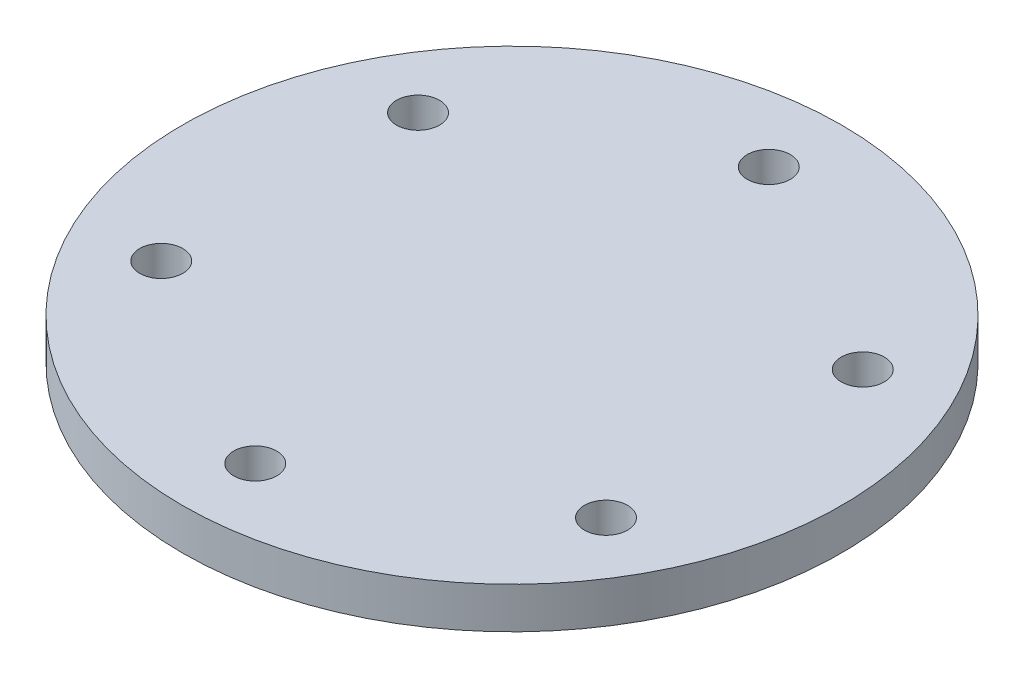
ISO-10303-21;
HEADER;
FILE_DESCRIPTION(('STEP AP214'),'2;1');
FILE_NAME('part.step','',(''),(''),'','','');
FILE_SCHEMA(('AUTOMOTIVE_DESIGN { 1 0 10303 214 1 1 1 1 }'));
ENDSEC;
DATA;
#1=APPLICATION_CONTEXT('core data for automotive mechanical design processes');
#2=APPLICATION_PROTOCOL_DEFINITION('international standard','automotive_design',2000,#1);
#3=PRODUCT_CONTEXT('',#1,'mechanical');
#4=PRODUCT('Part','Part','',(#3));
#5=PRODUCT_RELATED_PRODUCT_CATEGORY('part','',(#4));
#6=PRODUCT_DEFINITION_FORMATION('','',#4);
#7=PRODUCT_DEFINITION_CONTEXT('part definition',#1,'design');
#8=PRODUCT_DEFINITION('design','',#6,#7);
#9=PRODUCT_DEFINITION_SHAPE('','',#8);
#10=(LENGTH_UNIT() NAMED_UNIT(*) SI_UNIT(.MILLI.,.METRE.));
#11=(NAMED_UNIT(*) PLANE_ANGLE_UNIT() SI_UNIT($,.RADIAN.));
#12=(NAMED_UNIT(*) SI_UNIT($,.STERADIAN.) SOLID_ANGLE_UNIT());
#13=UNCERTAINTY_MEASURE_WITH_UNIT(LENGTH_MEASURE(1.E-05),#10,'distance_accuracy_value','');
#14=(GEOMETRIC_REPRESENTATION_CONTEXT(3) GLOBAL_UNCERTAINTY_ASSIGNED_CONTEXT((#13)) GLOBAL_UNIT_ASSIGNED_CONTEXT((#10,
#11,#12)) REPRESENTATION_CONTEXT('',''));
#15=CARTESIAN_POINT('',(0.,0.,0.));
#16=DIRECTION('',(0.,0.,1.));
#17=DIRECTION('',(1.,0.,0.));
#18=AXIS2_PLACEMENT_3D('',#15,#16,#17);
#19=CARTESIAN_POINT('',(0.,3.81,0.));
#20=DIRECTION('',(0.,-1.,0.));
#21=DIRECTION('',(0.,0.,-1.));
#22=AXIS2_PLACEMENT_3D('',#19,#20,#21);
#23=CYLINDRICAL_SURFACE('',#22,30.48);
#24=CARTESIAN_POINT('',(0.,3.81,0.));
#25=DIRECTION('',(0.,1.,0.));
#26=DIRECTION('',(0.,0.,1.));
#27=AXIS2_PLACEMENT_3D('',#24,#25,#26);
#28=CIRCLE('',#27,30.48);
#29=CARTESIAN_POINT('',(0.,3.81,-30.48));
#30=VERTEX_POINT('',#29);
#31=EDGE_CURVE('E10',#30,#30,#28,.T.);
#32=CARTESIAN_POINT('',(0.,0.,0.));
#33=DIRECTION('',(0.,1.,0.));
#34=DIRECTION('',(0.,0.,1.));
#35=AXIS2_PLACEMENT_3D('',#32,#33,#34);
#36=CIRCLE('',#35,30.48);
#37=CARTESIAN_POINT('',(0.,0.,-30.48));
#38=VERTEX_POINT('',#37);
#39=EDGE_CURVE('E34',#38,#38,#36,.T.);
#40=CARTESIAN_POINT('',(0.,3.81,-30.48));
#41=CARTESIAN_POINT('',(0.,3.7703125,-30.48));
#42=CARTESIAN_POINT('',(0.,3.730625,-30.48));
#43=CARTESIAN_POINT('',(0.,3.65125,-30.48));
#44=CARTESIAN_POINT('',(0.,3.6115625,-30.48));
#45=CARTESIAN_POINT('',(0.,3.5321875,-30.48));
#46=CARTESIAN_POINT('',(0.,3.4925,-30.48));
#47=CARTESIAN_POINT('',(0.,3.413125,-30.48));
#48=CARTESIAN_POINT('',(0.,3.3734375,-30.48));
#49=CARTESIAN_POINT('',(0.,3.2940625,-30.48));
#50=CARTESIAN_POINT('',(0.,3.254375,-30.48));
#51=CARTESIAN_POINT('',(0.,3.175,-30.48));
#52=CARTESIAN_POINT('',(0.,3.1353125,-30.48));
#53=CARTESIAN_POINT('',(0.,3.0559375,-30.48));
#54=CARTESIAN_POINT('',(0.,3.01625,-30.48));
#55=CARTESIAN_POINT('',(0.,2.936875,-30.48));
#56=CARTESIAN_POINT('',(0.,2.8971875,-30.48));
#57=CARTESIAN_POINT('',(0.,2.8178125,-30.48));
#58=CARTESIAN_POINT('',(0.,2.778125,-30.48));
#59=CARTESIAN_POINT('',(0.,2.69875,-30.48));
#60=CARTESIAN_POINT('',(0.,2.6590625,-30.48));
#61=CARTESIAN_POINT('',(0.,2.5796875,-30.48));
#62=CARTESIAN_POINT('',(0.,2.54,-30.48));
#63=CARTESIAN_POINT('',(0.,2.460625,-30.48));
#64=CARTESIAN_POINT('',(0.,2.4209375,-30.48));
#65=CARTESIAN_POINT('',(0.,2.3415625,-30.48));
#66=CARTESIAN_POINT('',(0.,2.301875,-30.48));
#67=CARTESIAN_POINT('',(0.,2.2225,-30.48));
#68=CARTESIAN_POINT('',(0.,2.1828125,-30.48));
#69=CARTESIAN_POINT('',(0.,2.1034375,-30.48));
#70=CARTESIAN_POINT('',(0.,2.06375,-30.48));
#71=CARTESIAN_POINT('',(0.,1.984375,-30.48));
#72=CARTESIAN_POINT('',(0.,1.9446875,-30.48));
#73=CARTESIAN_POINT('',(0.,1.8653125,-30.48));
#74=CARTESIAN_POINT('',(0.,1.825625,-30.48));
#75=CARTESIAN_POINT('',(0.,1.74625,-30.48));
#76=CARTESIAN_POINT('',(0.,1.7065625,-30.48));
#77=CARTESIAN_POINT('',(0.,1.6271875,-30.48));
#78=CARTESIAN_POINT('',(0.,1.5875,-30.48));
#79=CARTESIAN_POINT('',(0.,1.508125,-30.48));
#80=CARTESIAN_POINT('',(0.,1.4684375,-30.48));
#81=CARTESIAN_POINT('',(0.,1.3890625,-30.48));
#82=CARTESIAN_POINT('',(0.,1.349375,-30.48));
#83=CARTESIAN_POINT('',(0.,1.27,-30.48));
#84=CARTESIAN_POINT('',(0.,1.2303125,-30.48));
#85=CARTESIAN_POINT('',(0.,1.1509375,-30.48));
#86=CARTESIAN_POINT('',(0.,1.11125,-30.48));
#87=CARTESIAN_POINT('',(0.,1.031875,-30.48));
#88=CARTESIAN_POINT('',(0.,0.9921875,-30.48));
#89=CARTESIAN_POINT('',(0.,0.9128125,-30.48));
#90=CARTESIAN_POINT('',(0.,0.873125,-30.48));
#91=CARTESIAN_POINT('',(0.,0.79375,-30.48));
#92=CARTESIAN_POINT('',(0.,0.7540625,-30.48));
#93=CARTESIAN_POINT('',(0.,0.6746875,-30.48));
#94=CARTESIAN_POINT('',(0.,0.635,-30.48));
#95=CARTESIAN_POINT('',(0.,0.555625,-30.48));
#96=CARTESIAN_POINT('',(0.,0.5159375,-30.48));
#97=CARTESIAN_POINT('',(0.,0.4365625,-30.48));
#98=CARTESIAN_POINT('',(0.,0.396875,-30.48));
#99=CARTESIAN_POINT('',(0.,0.3175,-30.48));
#100=CARTESIAN_POINT('',(0.,0.2778125,-30.48));
#101=CARTESIAN_POINT('',(0.,0.1984375,-30.48));
#102=CARTESIAN_POINT('',(0.,0.15875,-30.48));
#103=CARTESIAN_POINT('',(0.,0.0793749999999999,-30.48));
#104=CARTESIAN_POINT('',(0.,0.0396874999999999,-30.48));
#105=CARTESIAN_POINT('',(0.,0.,-30.48));
#106=B_SPLINE_CURVE_WITH_KNOTS('',3,(#40,#41,#42,#43,#44,#45,#46,#47,#48,#49,#50,#51,#52,#53,
#54,#55,#56,#57,#58,#59,#60,#61,#62,#63,#64,#65,#66,#67,#68,#69,#70,#71,#72,#73,#74,#75,#76,#77,
#78,#79,#80,#81,#82,#83,#84,#85,#86,#87,#88,#89,#90,#91,#92,#93,#94,#95,#96,#97,#98,#99,#100,
#101,#102,#103,#104,#105),.UNSPECIFIED.,.F.,.F.,(4,2,2,2,2,2,2,2,2,2,2,2,2,2,2,2,2,2,2,2,2,2,2,
2,2,2,2,2,2,2,2,2,4),(0.,0.1190625,0.238125,0.3571875,0.47625,0.5953125,0.714375,0.8334375,
0.9525,1.0715625,1.190625,1.3096875,1.42875,1.5478125,1.666875,1.7859375,1.905,2.0240625,
2.143125,2.2621875,2.38125,2.5003125,2.619375,2.7384375,2.8575,2.9765625,3.095625,3.2146875,
3.33375,3.4528125,3.571875,3.6909375,3.81),.UNSPECIFIED.);
#107=EDGE_CURVE('BSEAM31',#30,#38,#106,.T.);
#108=ORIENTED_EDGE('',*,*,#31,.F.);
#109=ORIENTED_EDGE('',*,*,#39,.T.);
#110=ORIENTED_EDGE('',*,*,#107,.T.);
#111=ORIENTED_EDGE('',*,*,#107,.F.);
#112=EDGE_LOOP('',(#108,#110,#109,#111));
#113=FACE_BOUND('',#112,.T.);
#114=ADVANCED_FACE('F31',(#113),#23,.T.);
#115=CARTESIAN_POINT('',(0.,3.81,0.));
#116=DIRECTION('',(0.,1.,0.));
#117=DIRECTION('',(0.,0.,1.));
#118=AXIS2_PLACEMENT_3D('',#115,#116,#117);
#119=PLANE('',#118);
#120=CARTESIAN_POINT('',(20.5672373144765,3.81,11.8745000000002));
#121=DIRECTION('',(0.,1.,0.));
#122=DIRECTION('',(0.866025403784433,0.,0.50000000000001));
#123=AXIS2_PLACEMENT_3D('',#120,#121,#122);
#124=CIRCLE('',#123,1.9939);
#125=CARTESIAN_POINT('',(20.5672373144765,3.81,13.8684000000002));
#126=VERTEX_POINT('',#125);
#127=EDGE_CURVE('E73',#126,#126,#124,.T.);
#128=ORIENTED_EDGE('',*,*,#127,.F.);
#129=EDGE_LOOP('',(#128));
#130=FACE_BOUND('',#129,.T.);
#131=CARTESIAN_POINT('',(20.5672373144767,3.81,-11.8744999999998));
#132=DIRECTION('',(0.,1.,0.));
#133=DIRECTION('',(0.866025403784443,0.,-0.499999999999992));
#134=AXIS2_PLACEMENT_3D('',#131,#132,#133);
#135=CIRCLE('',#134,1.9939);
#136=CARTESIAN_POINT('',(20.5672373144767,3.81,-9.88059999999981));
#137=VERTEX_POINT('',#136);
#138=EDGE_CURVE('E67',#137,#137,#135,.T.);
#139=ORIENTED_EDGE('',*,*,#138,.F.);
#140=EDGE_LOOP('',(#139));
#141=FACE_BOUND('',#140,.T.);
#142=CARTESIAN_POINT('',(0.,3.81,-23.749));
#143=DIRECTION('',(0.,1.,0.));
#144=DIRECTION('',(0.,0.,-1.));
#145=AXIS2_PLACEMENT_3D('',#142,#143,#144);
#146=CIRCLE('',#145,1.9939);
#147=CARTESIAN_POINT('',(0.,3.81,-21.7551));
#148=VERTEX_POINT('',#147);
#149=EDGE_CURVE('E61',#148,#148,#146,.T.);
#150=ORIENTED_EDGE('',*,*,#149,.F.);
#151=EDGE_LOOP('',(#150));
#152=FACE_BOUND('',#151,.T.);
#153=CARTESIAN_POINT('',(-20.5672373144766,3.81,-11.8745000000001));
#154=DIRECTION('',(0.,1.,0.));
#155=DIRECTION('',(-0.866025403784436,0.,-0.500000000000004));
#156=AXIS2_PLACEMENT_3D('',#153,#154,#155);
#157=CIRCLE('',#156,1.9939);
#158=CARTESIAN_POINT('',(-20.5672373144766,3.81,-9.8806000000001));
#159=VERTEX_POINT('',#158);
#160=EDGE_CURVE('E55',#159,#159,#157,.T.);
#161=ORIENTED_EDGE('',*,*,#160,.F.);
#162=EDGE_LOOP('',(#161));
#163=FACE_BOUND('',#162,.T.);
#164=CARTESIAN_POINT('',(-20.5672373144767,3.81,11.8745));
#165=DIRECTION('',(0.,1.,0.));
#166=DIRECTION('',(-0.86602540378444,0.,0.499999999999998));
#167=AXIS2_PLACEMENT_3D('',#164,#165,#166);
#168=CIRCLE('',#167,1.9939);
#169=CARTESIAN_POINT('',(-20.5672373144767,3.81,13.8684));
#170=VERTEX_POINT('',#169);
#171=EDGE_CURVE('E49',#170,#170,#168,.T.);
#172=ORIENTED_EDGE('',*,*,#171,.F.);
#173=EDGE_LOOP('',(#172));
#174=FACE_BOUND('',#173,.T.);
#175=CARTESIAN_POINT('',(0.,3.81,23.749));
#176=DIRECTION('',(0.,1.,0.));
#177=DIRECTION('',(0.,0.,1.));
#178=AXIS2_PLACEMENT_3D('',#175,#176,#177);
#179=CIRCLE('',#178,1.9939);
#180=CARTESIAN_POINT('',(0.,3.81,25.7429));
#181=VERTEX_POINT('',#180);
#182=EDGE_CURVE('E43',#181,#181,#179,.T.);
#183=ORIENTED_EDGE('',*,*,#182,.F.);
#184=EDGE_LOOP('',(#183));
#185=FACE_BOUND('',#184,.T.);
#186=ORIENTED_EDGE('',*,*,#31,.T.);
#187=EDGE_LOOP('',(#186));
#188=FACE_BOUND('',#187,.T.);
#189=ADVANCED_FACE('F89',(#130,#141,#152,#163,#174,#185,#188),#119,.T.);
#190=CARTESIAN_POINT('',(0.,0.,0.));
#191=DIRECTION('',(0.,1.,0.));
#192=DIRECTION('',(0.,0.,1.));
#193=AXIS2_PLACEMENT_3D('',#190,#191,#192);
#194=PLANE('',#193);
#195=CARTESIAN_POINT('',(20.5672373144765,0.,11.8745000000002));
#196=DIRECTION('',(0.,1.,0.));
#197=DIRECTION('',(0.866025403784433,0.,0.50000000000001));
#198=AXIS2_PLACEMENT_3D('',#195,#196,#197);
#199=CIRCLE('',#198,1.9939);
#200=CARTESIAN_POINT('',(20.5672373144765,0.,13.8684000000002));
#201=VERTEX_POINT('',#200);
#202=EDGE_CURVE('E70',#201,#201,#199,.T.);
#203=ORIENTED_EDGE('',*,*,#202,.T.);
#204=EDGE_LOOP('',(#203));
#205=FACE_BOUND('',#204,.T.);
#206=CARTESIAN_POINT('',(20.5672373144767,0.,-11.8744999999998));
#207=DIRECTION('',(0.,1.,0.));
#208=DIRECTION('',(0.866025403784443,0.,-0.499999999999992));
#209=AXIS2_PLACEMENT_3D('',#206,#207,#208);
#210=CIRCLE('',#209,1.9939);
#211=CARTESIAN_POINT('',(20.5672373144767,0.,-9.88059999999981));
#212=VERTEX_POINT('',#211);
#213=EDGE_CURVE('E64',#212,#212,#210,.T.);
#214=ORIENTED_EDGE('',*,*,#213,.T.);
#215=EDGE_LOOP('',(#214));
#216=FACE_BOUND('',#215,.T.);
#217=CARTESIAN_POINT('',(0.,0.,-23.749));
#218=DIRECTION('',(0.,1.,0.));
#219=DIRECTION('',(0.,0.,-1.));
#220=AXIS2_PLACEMENT_3D('',#217,#218,#219);
#221=CIRCLE('',#220,1.9939);
#222=CARTESIAN_POINT('',(0.,0.,-21.7551));
#223=VERTEX_POINT('',#222);
#224=EDGE_CURVE('E58',#223,#223,#221,.T.);
#225=ORIENTED_EDGE('',*,*,#224,.T.);
#226=EDGE_LOOP('',(#225));
#227=FACE_BOUND('',#226,.T.);
#228=CARTESIAN_POINT('',(-20.5672373144766,0.,-11.8745000000001));
#229=DIRECTION('',(0.,1.,0.));
#230=DIRECTION('',(-0.866025403784436,0.,-0.500000000000004));
#231=AXIS2_PLACEMENT_3D('',#228,#229,#230);
#232=CIRCLE('',#231,1.9939);
#233=CARTESIAN_POINT('',(-20.5672373144766,0.,-9.8806000000001));
#234=VERTEX_POINT('',#233);
#235=EDGE_CURVE('E52',#234,#234,#232,.T.);
#236=ORIENTED_EDGE('',*,*,#235,.T.);
#237=EDGE_LOOP('',(#236));
#238=FACE_BOUND('',#237,.T.);
#239=CARTESIAN_POINT('',(-20.5672373144767,0.,11.8745));
#240=DIRECTION('',(0.,1.,0.));
#241=DIRECTION('',(-0.86602540378444,0.,0.499999999999998));
#242=AXIS2_PLACEMENT_3D('',#239,#240,#241);
#243=CIRCLE('',#242,1.9939);
#244=CARTESIAN_POINT('',(-20.5672373144767,0.,13.8684));
#245=VERTEX_POINT('',#244);
#246=EDGE_CURVE('E46',#245,#245,#243,.T.);
#247=ORIENTED_EDGE('',*,*,#246,.T.);
#248=EDGE_LOOP('',(#247));
#249=FACE_BOUND('',#248,.T.);
#250=CARTESIAN_POINT('',(0.,0.,23.749));
#251=DIRECTION('',(0.,1.,0.));
#252=DIRECTION('',(0.,0.,1.));
#253=AXIS2_PLACEMENT_3D('',#250,#251,#252);
#254=CIRCLE('',#253,1.9939);
#255=CARTESIAN_POINT('',(0.,0.,25.7429));
#256=VERTEX_POINT('',#255);
#257=EDGE_CURVE('E41',#256,#256,#254,.T.);
#258=ORIENTED_EDGE('',*,*,#257,.T.);
#259=EDGE_LOOP('',(#258));
#260=FACE_BOUND('',#259,.T.);
#261=ORIENTED_EDGE('',*,*,#39,.F.);
#262=EDGE_LOOP('',(#261));
#263=FACE_BOUND('',#262,.T.);
#264=ADVANCED_FACE('F79',(#205,#216,#227,#238,#249,#260,#263),#194,.F.);
#265=CARTESIAN_POINT('',(0.,0.,23.749));
#266=DIRECTION('',(0.,1.,0.));
#267=DIRECTION('',(0.,0.,1.));
#268=AXIS2_PLACEMENT_3D('',#265,#266,#267);
#269=CYLINDRICAL_SURFACE('',#268,1.9939);
#270=CARTESIAN_POINT('',(0.,0.,25.7429));
#271=CARTESIAN_POINT('',(0.,0.0396874999999999,25.7429));
#272=CARTESIAN_POINT('',(0.,0.079375,25.7429));
#273=CARTESIAN_POINT('',(0.,0.15875,25.7429));
#274=CARTESIAN_POINT('',(0.,0.1984375,25.7429));
#275=CARTESIAN_POINT('',(0.,0.2778125,25.7429));
#276=CARTESIAN_POINT('',(0.,0.3175,25.7429));
#277=CARTESIAN_POINT('',(0.,0.396875,25.7429));
#278=CARTESIAN_POINT('',(0.,0.4365625,25.7429));
#279=CARTESIAN_POINT('',(0.,0.5159375,25.7429));
#280=CARTESIAN_POINT('',(0.,0.555625,25.7429));
#281=CARTESIAN_POINT('',(0.,0.635,25.7429));
#282=CARTESIAN_POINT('',(0.,0.6746875,25.7429));
#283=CARTESIAN_POINT('',(0.,0.7540625,25.7429));
#284=CARTESIAN_POINT('',(0.,0.79375,25.7429));
#285=CARTESIAN_POINT('',(0.,0.873125,25.7429));
#286=CARTESIAN_POINT('',(0.,0.9128125,25.7429));
#287=CARTESIAN_POINT('',(0.,0.9921875,25.7429));
#288=CARTESIAN_POINT('',(0.,1.031875,25.7429));
#289=CARTESIAN_POINT('',(0.,1.11125,25.7429));
#290=CARTESIAN_POINT('',(0.,1.1509375,25.7429));
#291=CARTESIAN_POINT('',(0.,1.2303125,25.7429));
#292=CARTESIAN_POINT('',(0.,1.27,25.7429));
#293=CARTESIAN_POINT('',(0.,1.349375,25.7429));
#294=CARTESIAN_POINT('',(0.,1.3890625,25.7429));
#295=CARTESIAN_POINT('',(0.,1.4684375,25.7429));
#296=CARTESIAN_POINT('',(0.,1.508125,25.7429));
#297=CARTESIAN_POINT('',(0.,1.5875,25.7429));
#298=CARTESIAN_POINT('',(0.,1.6271875,25.7429));
#299=CARTESIAN_POINT('',(0.,1.7065625,25.7429));
#300=CARTESIAN_POINT('',(0.,1.74625,25.7429));
#301=CARTESIAN_POINT('',(0.,1.825625,25.7429));
#302=CARTESIAN_POINT('',(0.,1.8653125,25.7429));
#303=CARTESIAN_POINT('',(0.,1.9446875,25.7429));
#304=CARTESIAN_POINT('',(0.,1.984375,25.7429));
#305=CARTESIAN_POINT('',(0.,2.06375,25.7429));
#306=CARTESIAN_POINT('',(0.,2.1034375,25.7429));
#307=CARTESIAN_POINT('',(0.,2.1828125,25.7429));
#308=CARTESIAN_POINT('',(0.,2.2225,25.7429));
#309=CARTESIAN_POINT('',(0.,2.301875,25.7429));
#310=CARTESIAN_POINT('',(0.,2.3415625,25.7429));
#311=CARTESIAN_POINT('',(0.,2.4209375,25.7429));
#312=CARTESIAN_POINT('',(0.,2.460625,25.7429));
#313=CARTESIAN_POINT('',(0.,2.54,25.7429));
#314=CARTESIAN_POINT('',(0.,2.5796875,25.7429));
#315=CARTESIAN_POINT('',(0.,2.6590625,25.7429));
#316=CARTESIAN_POINT('',(0.,2.69875,25.7429));
#317=CARTESIAN_POINT('',(0.,2.778125,25.7429));
#318=CARTESIAN_POINT('',(0.,2.8178125,25.7429));
#319=CARTESIAN_POINT('',(0.,2.8971875,25.7429));
#320=CARTESIAN_POINT('',(0.,2.936875,25.7429));
#321=CARTESIAN_POINT('',(0.,3.01625,25.7429));
#322=CARTESIAN_POINT('',(0.,3.0559375,25.7429));
#323=CARTESIAN_POINT('',(0.,3.1353125,25.7429));
#324=CARTESIAN_POINT('',(0.,3.175,25.7429));
#325=CARTESIAN_POINT('',(0.,3.254375,25.7429));
#326=CARTESIAN_POINT('',(0.,3.2940625,25.7429));
#327=CARTESIAN_POINT('',(0.,3.3734375,25.7429));
#328=CARTESIAN_POINT('',(0.,3.413125,25.7429));
#329=CARTESIAN_POINT('',(0.,3.4925,25.7429));
#330=CARTESIAN_POINT('',(0.,3.5321875,25.7429));
#331=CARTESIAN_POINT('',(0.,3.6115625,25.7429));
#332=CARTESIAN_POINT('',(0.,3.65125,25.7429));
#333=CARTESIAN_POINT('',(0.,3.730625,25.7429));
#334=CARTESIAN_POINT('',(0.,3.7703125,25.7429));
#335=CARTESIAN_POINT('',(0.,3.81,25.7429));
#336=B_SPLINE_CURVE_WITH_KNOTS('',3,(#270,#271,#272,#273,#274,#275,#276,#277,#278,#279,#280,
#281,#282,#283,#284,#285,#286,#287,#288,#289,#290,#291,#292,#293,#294,#295,#296,#297,#298,#299,
#300,#301,#302,#303,#304,#305,#306,#307,#308,#309,#310,#311,#312,#313,#314,#315,#316,#317,#318,
#319,#320,#321,#322,#323,#324,#325,#326,#327,#328,#329,#330,#331,#332,#333,#334,#335),
.UNSPECIFIED.,.F.,.F.,(4,2,2,2,2,2,2,2,2,2,2,2,2,2,2,2,2,2,2,2,2,2,2,2,2,2,2,2,2,2,2,2,4),(0.,
0.1190625,0.238125,0.3571875,0.47625,0.5953125,0.714375,0.8334375,0.9525,1.0715625,1.190625,
1.3096875,1.42875,1.5478125,1.666875,1.7859375,1.905,2.0240625,2.143125,2.2621875,2.38125,
2.5003125,2.619375,2.7384375,2.8575,2.9765625,3.095625,3.2146875,3.33375,3.4528125,3.571875,
3.6909375,3.81),.UNSPECIFIED.);
#337=EDGE_CURVE('BSEAM103',#256,#181,#336,.T.);
#338=ORIENTED_EDGE('',*,*,#257,.F.);
#339=ORIENTED_EDGE('',*,*,#182,.T.);
#340=ORIENTED_EDGE('',*,*,#337,.T.);
#341=ORIENTED_EDGE('',*,*,#337,.F.);
#342=EDGE_LOOP('',(#338,#340,#339,#341));
#343=FACE_BOUND('',#342,.T.);
#344=ADVANCED_FACE('F103',(#343),#269,.F.);
#345=CARTESIAN_POINT('',(-20.5672373144767,0.,11.8745));
#346=DIRECTION('',(0.,1.,0.));
#347=DIRECTION('',(0.,0.,1.));
#348=AXIS2_PLACEMENT_3D('',#345,#346,#347);
#349=CYLINDRICAL_SURFACE('',#348,1.9939);
#350=CARTESIAN_POINT('',(-20.5672373144767,0.,13.8684));
#351=CARTESIAN_POINT('',(-20.5672373144767,0.0396874999999999,13.8684));
#352=CARTESIAN_POINT('',(-20.5672373144767,0.079375,13.8684));
#353=CARTESIAN_POINT('',(-20.5672373144767,0.15875,13.8684));
#354=CARTESIAN_POINT('',(-20.5672373144767,0.1984375,13.8684));
#355=CARTESIAN_POINT('',(-20.5672373144767,0.2778125,13.8684));
#356=CARTESIAN_POINT('',(-20.5672373144767,0.3175,13.8684));
#357=CARTESIAN_POINT('',(-20.5672373144767,0.396875,13.8684));
#358=CARTESIAN_POINT('',(-20.5672373144767,0.4365625,13.8684));
#359=CARTESIAN_POINT('',(-20.5672373144767,0.5159375,13.8684));
#360=CARTESIAN_POINT('',(-20.5672373144767,0.555625,13.8684));
#361=CARTESIAN_POINT('',(-20.5672373144767,0.635,13.8684));
#362=CARTESIAN_POINT('',(-20.5672373144767,0.6746875,13.8684));
#363=CARTESIAN_POINT('',(-20.5672373144767,0.7540625,13.8684));
#364=CARTESIAN_POINT('',(-20.5672373144767,0.79375,13.8684));
#365=CARTESIAN_POINT('',(-20.5672373144767,0.873125,13.8684));
#366=CARTESIAN_POINT('',(-20.5672373144767,0.9128125,13.8684));
#367=CARTESIAN_POINT('',(-20.5672373144767,0.9921875,13.8684));
#368=CARTESIAN_POINT('',(-20.5672373144767,1.031875,13.8684));
#369=CARTESIAN_POINT('',(-20.5672373144767,1.11125,13.8684));
#370=CARTESIAN_POINT('',(-20.5672373144767,1.1509375,13.8684));
#371=CARTESIAN_POINT('',(-20.5672373144767,1.2303125,13.8684));
#372=CARTESIAN_POINT('',(-20.5672373144767,1.27,13.8684));
#373=CARTESIAN_POINT('',(-20.5672373144767,1.349375,13.8684));
#374=CARTESIAN_POINT('',(-20.5672373144767,1.3890625,13.8684));
#375=CARTESIAN_POINT('',(-20.5672373144767,1.4684375,13.8684));
#376=CARTESIAN_POINT('',(-20.5672373144767,1.508125,13.8684));
#377=CARTESIAN_POINT('',(-20.5672373144767,1.5875,13.8684));
#378=CARTESIAN_POINT('',(-20.5672373144767,1.6271875,13.8684));
#379=CARTESIAN_POINT('',(-20.5672373144767,1.7065625,13.8684));
#380=CARTESIAN_POINT('',(-20.5672373144767,1.74625,13.8684));
#381=CARTESIAN_POINT('',(-20.5672373144767,1.825625,13.8684));
#382=CARTESIAN_POINT('',(-20.5672373144767,1.8653125,13.8684));
#383=CARTESIAN_POINT('',(-20.5672373144767,1.9446875,13.8684));
#384=CARTESIAN_POINT('',(-20.5672373144767,1.984375,13.8684));
#385=CARTESIAN_POINT('',(-20.5672373144767,2.06375,13.8684));
#386=CARTESIAN_POINT('',(-20.5672373144767,2.1034375,13.8684));
#387=CARTESIAN_POINT('',(-20.5672373144767,2.1828125,13.8684));
#388=CARTESIAN_POINT('',(-20.5672373144767,2.2225,13.8684));
#389=CARTESIAN_POINT('',(-20.5672373144767,2.301875,13.8684));
#390=CARTESIAN_POINT('',(-20.5672373144767,2.3415625,13.8684));
#391=CARTESIAN_POINT('',(-20.5672373144767,2.4209375,13.8684));
#392=CARTESIAN_POINT('',(-20.5672373144767,2.460625,13.8684));
#393=CARTESIAN_POINT('',(-20.5672373144767,2.54,13.8684));
#394=CARTESIAN_POINT('',(-20.5672373144767,2.5796875,13.8684));
#395=CARTESIAN_POINT('',(-20.5672373144767,2.6590625,13.8684));
#396=CARTESIAN_POINT('',(-20.5672373144767,2.69875,13.8684));
#397=CARTESIAN_POINT('',(-20.5672373144767,2.778125,13.8684));
#398=CARTESIAN_POINT('',(-20.5672373144767,2.8178125,13.8684));
#399=CARTESIAN_POINT('',(-20.5672373144767,2.8971875,13.8684));
#400=CARTESIAN_POINT('',(-20.5672373144767,2.936875,13.8684));
#401=CARTESIAN_POINT('',(-20.5672373144767,3.01625,13.8684));
#402=CARTESIAN_POINT('',(-20.5672373144767,3.0559375,13.8684));
#403=CARTESIAN_POINT('',(-20.5672373144767,3.1353125,13.8684));
#404=CARTESIAN_POINT('',(-20.5672373144767,3.175,13.8684));
#405=CARTESIAN_POINT('',(-20.5672373144767,3.254375,13.8684));
#406=CARTESIAN_POINT('',(-20.5672373144767,3.2940625,13.8684));
#407=CARTESIAN_POINT('',(-20.5672373144767,3.3734375,13.8684));
#408=CARTESIAN_POINT('',(-20.5672373144767,3.413125,13.8684));
#409=CARTESIAN_POINT('',(-20.5672373144767,3.4925,13.8684));
#410=CARTESIAN_POINT('',(-20.5672373144767,3.5321875,13.8684));
#411=CARTESIAN_POINT('',(-20.5672373144767,3.6115625,13.8684));
#412=CARTESIAN_POINT('',(-20.5672373144767,3.65125,13.8684));
#413=CARTESIAN_POINT('',(-20.5672373144767,3.730625,13.8684));
#414=CARTESIAN_POINT('',(-20.5672373144767,3.7703125,13.8684));
#415=CARTESIAN_POINT('',(-20.5672373144767,3.81,13.8684));
#416=B_SPLINE_CURVE_WITH_KNOTS('',3,(#350,#351,#352,#353,#354,#355,#356,#357,#358,#359,#360,
#361,#362,#363,#364,#365,#366,#367,#368,#369,#370,#371,#372,#373,#374,#375,#376,#377,#378,#379,
#380,#381,#382,#383,#384,#385,#386,#387,#388,#389,#390,#391,#392,#393,#394,#395,#396,#397,#398,
#399,#400,#401,#402,#403,#404,#405,#406,#407,#408,#409,#410,#411,#412,#413,#414,#415),
.UNSPECIFIED.,.F.,.F.,(4,2,2,2,2,2,2,2,2,2,2,2,2,2,2,2,2,2,2,2,2,2,2,2,2,2,2,2,2,2,2,2,4),(0.,
0.1190625,0.238125,0.3571875,0.47625,0.5953125,0.714375,0.8334375,0.9525,1.0715625,1.190625,
1.3096875,1.42875,1.5478125,1.666875,1.7859375,1.905,2.0240625,2.143125,2.2621875,2.38125,
2.5003125,2.619375,2.7384375,2.8575,2.9765625,3.095625,3.2146875,3.33375,3.4528125,3.571875,
3.6909375,3.81),.UNSPECIFIED.);
#417=EDGE_CURVE('BSEAM105',#245,#170,#416,.T.);
#418=ORIENTED_EDGE('',*,*,#246,.F.);
#419=ORIENTED_EDGE('',*,*,#171,.T.);
#420=ORIENTED_EDGE('',*,*,#417,.T.);
#421=ORIENTED_EDGE('',*,*,#417,.F.);
#422=EDGE_LOOP('',(#418,#420,#419,#421));
#423=FACE_BOUND('',#422,.T.);
#424=ADVANCED_FACE('F105',(#423),#349,.F.);
#425=CARTESIAN_POINT('',(-20.5672373144766,0.,-11.8745000000001));
#426=DIRECTION('',(0.,1.,0.));
#427=DIRECTION('',(0.,0.,1.));
#428=AXIS2_PLACEMENT_3D('',#425,#426,#427);
#429=CYLINDRICAL_SURFACE('',#428,1.9939);
#430=CARTESIAN_POINT('',(-20.5672373144766,0.,-9.8806000000001));
#431=CARTESIAN_POINT('',(-20.5672373144766,0.0396874999999999,-9.8806000000001));
#432=CARTESIAN_POINT('',(-20.5672373144766,0.079375,-9.8806000000001));
#433=CARTESIAN_POINT('',(-20.5672373144766,0.15875,-9.8806000000001));
#434=CARTESIAN_POINT('',(-20.5672373144766,0.1984375,-9.8806000000001));
#435=CARTESIAN_POINT('',(-20.5672373144766,0.2778125,-9.8806000000001));
#436=CARTESIAN_POINT('',(-20.5672373144766,0.3175,-9.8806000000001));
#437=CARTESIAN_POINT('',(-20.5672373144766,0.396875,-9.8806000000001));
#438=CARTESIAN_POINT('',(-20.5672373144766,0.4365625,-9.8806000000001));
#439=CARTESIAN_POINT('',(-20.5672373144766,0.5159375,-9.8806000000001));
#440=CARTESIAN_POINT('',(-20.5672373144766,0.555625,-9.8806000000001));
#441=CARTESIAN_POINT('',(-20.5672373144766,0.635,-9.8806000000001));
#442=CARTESIAN_POINT('',(-20.5672373144766,0.6746875,-9.8806000000001));
#443=CARTESIAN_POINT('',(-20.5672373144766,0.7540625,-9.8806000000001));
#444=CARTESIAN_POINT('',(-20.5672373144766,0.79375,-9.8806000000001));
#445=CARTESIAN_POINT('',(-20.5672373144766,0.873125,-9.8806000000001));
#446=CARTESIAN_POINT('',(-20.5672373144766,0.9128125,-9.8806000000001));
#447=CARTESIAN_POINT('',(-20.5672373144766,0.9921875,-9.8806000000001));
#448=CARTESIAN_POINT('',(-20.5672373144766,1.031875,-9.8806000000001));
#449=CARTESIAN_POINT('',(-20.5672373144766,1.11125,-9.8806000000001));
#450=CARTESIAN_POINT('',(-20.5672373144766,1.1509375,-9.8806000000001));
#451=CARTESIAN_POINT('',(-20.5672373144766,1.2303125,-9.8806000000001));
#452=CARTESIAN_POINT('',(-20.5672373144766,1.27,-9.8806000000001));
#453=CARTESIAN_POINT('',(-20.5672373144766,1.349375,-9.8806000000001));
#454=CARTESIAN_POINT('',(-20.5672373144766,1.3890625,-9.8806000000001));
#455=CARTESIAN_POINT('',(-20.5672373144766,1.4684375,-9.8806000000001));
#456=CARTESIAN_POINT('',(-20.5672373144766,1.508125,-9.8806000000001));
#457=CARTESIAN_POINT('',(-20.5672373144766,1.5875,-9.8806000000001));
#458=CARTESIAN_POINT('',(-20.5672373144766,1.6271875,-9.8806000000001));
#459=CARTESIAN_POINT('',(-20.5672373144766,1.7065625,-9.8806000000001));
#460=CARTESIAN_POINT('',(-20.5672373144766,1.74625,-9.8806000000001));
#461=CARTESIAN_POINT('',(-20.5672373144766,1.825625,-9.8806000000001));
#462=CARTESIAN_POINT('',(-20.5672373144766,1.8653125,-9.8806000000001));
#463=CARTESIAN_POINT('',(-20.5672373144766,1.9446875,-9.8806000000001));
#464=CARTESIAN_POINT('',(-20.5672373144766,1.984375,-9.8806000000001));
#465=CARTESIAN_POINT('',(-20.5672373144766,2.06375,-9.8806000000001));
#466=CARTESIAN_POINT('',(-20.5672373144766,2.1034375,-9.8806000000001));
#467=CARTESIAN_POINT('',(-20.5672373144766,2.1828125,-9.8806000000001));
#468=CARTESIAN_POINT('',(-20.5672373144766,2.2225,-9.8806000000001));
#469=CARTESIAN_POINT('',(-20.5672373144766,2.301875,-9.8806000000001));
#470=CARTESIAN_POINT('',(-20.5672373144766,2.3415625,-9.8806000000001));
#471=CARTESIAN_POINT('',(-20.5672373144766,2.4209375,-9.8806000000001));
#472=CARTESIAN_POINT('',(-20.5672373144766,2.460625,-9.8806000000001));
#473=CARTESIAN_POINT('',(-20.5672373144766,2.54,-9.8806000000001));
#474=CARTESIAN_POINT('',(-20.5672373144766,2.5796875,-9.8806000000001));
#475=CARTESIAN_POINT('',(-20.5672373144766,2.6590625,-9.8806000000001));
#476=CARTESIAN_POINT('',(-20.5672373144766,2.69875,-9.8806000000001));
#477=CARTESIAN_POINT('',(-20.5672373144766,2.778125,-9.8806000000001));
#478=CARTESIAN_POINT('',(-20.5672373144766,2.8178125,-9.8806000000001));
#479=CARTESIAN_POINT('',(-20.5672373144766,2.8971875,-9.8806000000001));
#480=CARTESIAN_POINT('',(-20.5672373144766,2.936875,-9.8806000000001));
#481=CARTESIAN_POINT('',(-20.5672373144766,3.01625,-9.8806000000001));
#482=CARTESIAN_POINT('',(-20.5672373144766,3.0559375,-9.8806000000001));
#483=CARTESIAN_POINT('',(-20.5672373144766,3.1353125,-9.8806000000001));
#484=CARTESIAN_POINT('',(-20.5672373144766,3.175,-9.8806000000001));
#485=CARTESIAN_POINT('',(-20.5672373144766,3.254375,-9.8806000000001));
#486=CARTESIAN_POINT('',(-20.5672373144766,3.2940625,-9.8806000000001));
#487=CARTESIAN_POINT('',(-20.5672373144766,3.3734375,-9.8806000000001));
#488=CARTESIAN_POINT('',(-20.5672373144766,3.413125,-9.8806000000001));
#489=CARTESIAN_POINT('',(-20.5672373144766,3.4925,-9.8806000000001));
#490=CARTESIAN_POINT('',(-20.5672373144766,3.5321875,-9.8806000000001));
#491=CARTESIAN_POINT('',(-20.5672373144766,3.6115625,-9.8806000000001));
#492=CARTESIAN_POINT('',(-20.5672373144766,3.65125,-9.8806000000001));
#493=CARTESIAN_POINT('',(-20.5672373144766,3.730625,-9.8806000000001));
#494=CARTESIAN_POINT('',(-20.5672373144766,3.7703125,-9.8806000000001));
#495=CARTESIAN_POINT('',(-20.5672373144766,3.81,-9.8806000000001));
#496=B_SPLINE_CURVE_WITH_KNOTS('',3,(#430,#431,#432,#433,#434,#435,#436,#437,#438,#439,#440,
#441,#442,#443,#444,#445,#446,#447,#448,#449,#450,#451,#452,#453,#454,#455,#456,#457,#458,#459,
#460,#461,#462,#463,#464,#465,#466,#467,#468,#469,#470,#471,#472,#473,#474,#475,#476,#477,#478,
#479,#480,#481,#482,#483,#484,#485,#486,#487,#488,#489,#490,#491,#492,#493,#494,#495),
.UNSPECIFIED.,.F.,.F.,(4,2,2,2,2,2,2,2,2,2,2,2,2,2,2,2,2,2,2,2,2,2,2,2,2,2,2,2,2,2,2,2,4),(0.,
0.1190625,0.238125,0.3571875,0.47625,0.5953125,0.714375,0.8334375,0.9525,1.0715625,1.190625,
1.3096875,1.42875,1.5478125,1.666875,1.7859375,1.905,2.0240625,2.143125,2.2621875,2.38125,
2.5003125,2.619375,2.7384375,2.8575,2.9765625,3.095625,3.2146875,3.33375,3.4528125,3.571875,
3.6909375,3.81),.UNSPECIFIED.);
#497=EDGE_CURVE('BSEAM112',#234,#159,#496,.T.);
#498=ORIENTED_EDGE('',*,*,#235,.F.);
#499=ORIENTED_EDGE('',*,*,#160,.T.);
#500=ORIENTED_EDGE('',*,*,#497,.T.);
#501=ORIENTED_EDGE('',*,*,#497,.F.);
#502=EDGE_LOOP('',(#498,#500,#499,#501));
#503=FACE_BOUND('',#502,.T.);
#504=ADVANCED_FACE('F112',(#503),#429,.F.);
#505=CARTESIAN_POINT('',(0.,0.,-23.749));
#506=DIRECTION('',(0.,1.,0.));
#507=DIRECTION('',(0.,0.,1.));
#508=AXIS2_PLACEMENT_3D('',#505,#506,#507);
#509=CYLINDRICAL_SURFACE('',#508,1.9939);
#510=CARTESIAN_POINT('',(0.,0.,-21.7551));
#511=CARTESIAN_POINT('',(0.,0.0396874999999999,-21.7551));
#512=CARTESIAN_POINT('',(0.,0.079375,-21.7551));
#513=CARTESIAN_POINT('',(0.,0.15875,-21.7551));
#514=CARTESIAN_POINT('',(0.,0.1984375,-21.7551));
#515=CARTESIAN_POINT('',(0.,0.2778125,-21.7551));
#516=CARTESIAN_POINT('',(0.,0.3175,-21.7551));
#517=CARTESIAN_POINT('',(0.,0.396875,-21.7551));
#518=CARTESIAN_POINT('',(0.,0.4365625,-21.7551));
#519=CARTESIAN_POINT('',(0.,0.5159375,-21.7551));
#520=CARTESIAN_POINT('',(0.,0.555625,-21.7551));
#521=CARTESIAN_POINT('',(0.,0.635,-21.7551));
#522=CARTESIAN_POINT('',(0.,0.6746875,-21.7551));
#523=CARTESIAN_POINT('',(0.,0.7540625,-21.7551));
#524=CARTESIAN_POINT('',(0.,0.79375,-21.7551));
#525=CARTESIAN_POINT('',(0.,0.873125,-21.7551));
#526=CARTESIAN_POINT('',(0.,0.9128125,-21.7551));
#527=CARTESIAN_POINT('',(0.,0.9921875,-21.7551));
#528=CARTESIAN_POINT('',(0.,1.031875,-21.7551));
#529=CARTESIAN_POINT('',(0.,1.11125,-21.7551));
#530=CARTESIAN_POINT('',(0.,1.1509375,-21.7551));
#531=CARTESIAN_POINT('',(0.,1.2303125,-21.7551));
#532=CARTESIAN_POINT('',(0.,1.27,-21.7551));
#533=CARTESIAN_POINT('',(0.,1.349375,-21.7551));
#534=CARTESIAN_POINT('',(0.,1.3890625,-21.7551));
#535=CARTESIAN_POINT('',(0.,1.4684375,-21.7551));
#536=CARTESIAN_POINT('',(0.,1.508125,-21.7551));
#537=CARTESIAN_POINT('',(0.,1.5875,-21.7551));
#538=CARTESIAN_POINT('',(0.,1.6271875,-21.7551));
#539=CARTESIAN_POINT('',(0.,1.7065625,-21.7551));
#540=CARTESIAN_POINT('',(0.,1.74625,-21.7551));
#541=CARTESIAN_POINT('',(0.,1.825625,-21.7551));
#542=CARTESIAN_POINT('',(0.,1.8653125,-21.7551));
#543=CARTESIAN_POINT('',(0.,1.9446875,-21.7551));
#544=CARTESIAN_POINT('',(0.,1.984375,-21.7551));
#545=CARTESIAN_POINT('',(0.,2.06375,-21.7551));
#546=CARTESIAN_POINT('',(0.,2.1034375,-21.7551));
#547=CARTESIAN_POINT('',(0.,2.1828125,-21.7551));
#548=CARTESIAN_POINT('',(0.,2.2225,-21.7551));
#549=CARTESIAN_POINT('',(0.,2.301875,-21.7551));
#550=CARTESIAN_POINT('',(0.,2.3415625,-21.7551));
#551=CARTESIAN_POINT('',(0.,2.4209375,-21.7551));
#552=CARTESIAN_POINT('',(0.,2.460625,-21.7551));
#553=CARTESIAN_POINT('',(0.,2.54,-21.7551));
#554=CARTESIAN_POINT('',(0.,2.5796875,-21.7551));
#555=CARTESIAN_POINT('',(0.,2.6590625,-21.7551));
#556=CARTESIAN_POINT('',(0.,2.69875,-21.7551));
#557=CARTESIAN_POINT('',(0.,2.778125,-21.7551));
#558=CARTESIAN_POINT('',(0.,2.8178125,-21.7551));
#559=CARTESIAN_POINT('',(0.,2.8971875,-21.7551));
#560=CARTESIAN_POINT('',(0.,2.936875,-21.7551));
#561=CARTESIAN_POINT('',(0.,3.01625,-21.7551));
#562=CARTESIAN_POINT('',(0.,3.0559375,-21.7551));
#563=CARTESIAN_POINT('',(0.,3.1353125,-21.7551));
#564=CARTESIAN_POINT('',(0.,3.175,-21.7551));
#565=CARTESIAN_POINT('',(0.,3.254375,-21.7551));
#566=CARTESIAN_POINT('',(0.,3.2940625,-21.7551));
#567=CARTESIAN_POINT('',(0.,3.3734375,-21.7551));
#568=CARTESIAN_POINT('',(0.,3.413125,-21.7551));
#569=CARTESIAN_POINT('',(0.,3.4925,-21.7551));
#570=CARTESIAN_POINT('',(0.,3.5321875,-21.7551));
#571=CARTESIAN_POINT('',(0.,3.6115625,-21.7551));
#572=CARTESIAN_POINT('',(0.,3.65125,-21.7551));
#573=CARTESIAN_POINT('',(0.,3.730625,-21.7551));
#574=CARTESIAN_POINT('',(0.,3.7703125,-21.7551));
#575=CARTESIAN_POINT('',(0.,3.81,-21.7551));
#576=B_SPLINE_CURVE_WITH_KNOTS('',3,(#510,#511,#512,#513,#514,#515,#516,#517,#518,#519,#520,
#521,#522,#523,#524,#525,#526,#527,#528,#529,#530,#531,#532,#533,#534,#535,#536,#537,#538,#539,
#540,#541,#542,#543,#544,#545,#546,#547,#548,#549,#550,#551,#552,#553,#554,#555,#556,#557,#558,
#559,#560,#561,#562,#563,#564,#565,#566,#567,#568,#569,#570,#571,#572,#573,#574,#575),
.UNSPECIFIED.,.F.,.F.,(4,2,2,2,2,2,2,2,2,2,2,2,2,2,2,2,2,2,2,2,2,2,2,2,2,2,2,2,2,2,2,2,4),(0.,
0.1190625,0.238125,0.3571875,0.47625,0.5953125,0.714375,0.8334375,0.9525,1.0715625,1.190625,
1.3096875,1.42875,1.5478125,1.666875,1.7859375,1.905,2.0240625,2.143125,2.2621875,2.38125,
2.5003125,2.619375,2.7384375,2.8575,2.9765625,3.095625,3.2146875,3.33375,3.4528125,3.571875,
3.6909375,3.81),.UNSPECIFIED.);
#577=EDGE_CURVE('BSEAM147',#223,#148,#576,.T.);
#578=ORIENTED_EDGE('',*,*,#224,.F.);
#579=ORIENTED_EDGE('',*,*,#149,.T.);
#580=ORIENTED_EDGE('',*,*,#577,.T.);
#581=ORIENTED_EDGE('',*,*,#577,.F.);
#582=EDGE_LOOP('',(#578,#580,#579,#581));
#583=FACE_BOUND('',#582,.T.);
#584=ADVANCED_FACE('F147',(#583),#509,.F.);
#585=CARTESIAN_POINT('',(20.5672373144767,0.,-11.8744999999998));
#586=DIRECTION('',(0.,1.,0.));
#587=DIRECTION('',(0.,0.,1.));
#588=AXIS2_PLACEMENT_3D('',#585,#586,#587);
#589=CYLINDRICAL_SURFACE('',#588,1.9939);
#590=CARTESIAN_POINT('',(20.5672373144767,0.,-9.88059999999981));
#591=CARTESIAN_POINT('',(20.5672373144767,0.0396874999999999,-9.88059999999981));
#592=CARTESIAN_POINT('',(20.5672373144767,0.079375,-9.88059999999981));
#593=CARTESIAN_POINT('',(20.5672373144767,0.15875,-9.88059999999981));
#594=CARTESIAN_POINT('',(20.5672373144767,0.1984375,-9.88059999999981));
#595=CARTESIAN_POINT('',(20.5672373144767,0.2778125,-9.88059999999981));
#596=CARTESIAN_POINT('',(20.5672373144767,0.3175,-9.88059999999981));
#597=CARTESIAN_POINT('',(20.5672373144767,0.396875,-9.88059999999981));
#598=CARTESIAN_POINT('',(20.5672373144767,0.4365625,-9.88059999999981));
#599=CARTESIAN_POINT('',(20.5672373144767,0.5159375,-9.88059999999981));
#600=CARTESIAN_POINT('',(20.5672373144767,0.555625,-9.88059999999981));
#601=CARTESIAN_POINT('',(20.5672373144767,0.635,-9.88059999999981));
#602=CARTESIAN_POINT('',(20.5672373144767,0.6746875,-9.88059999999981));
#603=CARTESIAN_POINT('',(20.5672373144767,0.7540625,-9.88059999999981));
#604=CARTESIAN_POINT('',(20.5672373144767,0.79375,-9.88059999999981));
#605=CARTESIAN_POINT('',(20.5672373144767,0.873125,-9.88059999999981));
#606=CARTESIAN_POINT('',(20.5672373144767,0.9128125,-9.88059999999981));
#607=CARTESIAN_POINT('',(20.5672373144767,0.9921875,-9.88059999999981));
#608=CARTESIAN_POINT('',(20.5672373144767,1.031875,-9.88059999999981));
#609=CARTESIAN_POINT('',(20.5672373144767,1.11125,-9.88059999999981));
#610=CARTESIAN_POINT('',(20.5672373144767,1.1509375,-9.88059999999981));
#611=CARTESIAN_POINT('',(20.5672373144767,1.2303125,-9.88059999999981));
#612=CARTESIAN_POINT('',(20.5672373144767,1.27,-9.88059999999981));
#613=CARTESIAN_POINT('',(20.5672373144767,1.349375,-9.88059999999981));
#614=CARTESIAN_POINT('',(20.5672373144767,1.3890625,-9.88059999999981));
#615=CARTESIAN_POINT('',(20.5672373144767,1.4684375,-9.88059999999981));
#616=CARTESIAN_POINT('',(20.5672373144767,1.508125,-9.88059999999981));
#617=CARTESIAN_POINT('',(20.5672373144767,1.5875,-9.88059999999981));
#618=CARTESIAN_POINT('',(20.5672373144767,1.6271875,-9.88059999999981));
#619=CARTESIAN_POINT('',(20.5672373144767,1.7065625,-9.88059999999981));
#620=CARTESIAN_POINT('',(20.5672373144767,1.74625,-9.88059999999981));
#621=CARTESIAN_POINT('',(20.5672373144767,1.825625,-9.88059999999981));
#622=CARTESIAN_POINT('',(20.5672373144767,1.8653125,-9.88059999999981));
#623=CARTESIAN_POINT('',(20.5672373144767,1.9446875,-9.88059999999981));
#624=CARTESIAN_POINT('',(20.5672373144767,1.984375,-9.88059999999981));
#625=CARTESIAN_POINT('',(20.5672373144767,2.06375,-9.88059999999981));
#626=CARTESIAN_POINT('',(20.5672373144767,2.1034375,-9.88059999999981));
#627=CARTESIAN_POINT('',(20.5672373144767,2.1828125,-9.88059999999981));
#628=CARTESIAN_POINT('',(20.5672373144767,2.2225,-9.88059999999981));
#629=CARTESIAN_POINT('',(20.5672373144767,2.301875,-9.88059999999981));
#630=CARTESIAN_POINT('',(20.5672373144767,2.3415625,-9.88059999999981));
#631=CARTESIAN_POINT('',(20.5672373144767,2.4209375,-9.88059999999981));
#632=CARTESIAN_POINT('',(20.5672373144767,2.460625,-9.88059999999981));
#633=CARTESIAN_POINT('',(20.5672373144767,2.54,-9.88059999999981));
#634=CARTESIAN_POINT('',(20.5672373144767,2.5796875,-9.88059999999981));
#635=CARTESIAN_POINT('',(20.5672373144767,2.6590625,-9.88059999999981));
#636=CARTESIAN_POINT('',(20.5672373144767,2.69875,-9.88059999999981));
#637=CARTESIAN_POINT('',(20.5672373144767,2.778125,-9.88059999999981));
#638=CARTESIAN_POINT('',(20.5672373144767,2.8178125,-9.88059999999981));
#639=CARTESIAN_POINT('',(20.5672373144767,2.8971875,-9.88059999999981));
#640=CARTESIAN_POINT('',(20.5672373144767,2.936875,-9.88059999999981));
#641=CARTESIAN_POINT('',(20.5672373144767,3.01625,-9.88059999999981));
#642=CARTESIAN_POINT('',(20.5672373144767,3.0559375,-9.88059999999981));
#643=CARTESIAN_POINT('',(20.5672373144767,3.1353125,-9.88059999999981));
#644=CARTESIAN_POINT('',(20.5672373144767,3.175,-9.88059999999981));
#645=CARTESIAN_POINT('',(20.5672373144767,3.254375,-9.88059999999981));
#646=CARTESIAN_POINT('',(20.5672373144767,3.2940625,-9.88059999999981));
#647=CARTESIAN_POINT('',(20.5672373144767,3.3734375,-9.88059999999981));
#648=CARTESIAN_POINT('',(20.5672373144767,3.413125,-9.88059999999981));
#649=CARTESIAN_POINT('',(20.5672373144767,3.4925,-9.88059999999981));
#650=CARTESIAN_POINT('',(20.5672373144767,3.5321875,-9.88059999999981));
#651=CARTESIAN_POINT('',(20.5672373144767,3.6115625,-9.88059999999981));
#652=CARTESIAN_POINT('',(20.5672373144767,3.65125,-9.88059999999981));
#653=CARTESIAN_POINT('',(20.5672373144767,3.730625,-9.88059999999981));
#654=CARTESIAN_POINT('',(20.5672373144767,3.7703125,-9.88059999999981));
#655=CARTESIAN_POINT('',(20.5672373144767,3.81,-9.88059999999981));
#656=B_SPLINE_CURVE_WITH_KNOTS('',3,(#590,#591,#592,#593,#594,#595,#596,#597,#598,#599,#600,
#601,#602,#603,#604,#605,#606,#607,#608,#609,#610,#611,#612,#613,#614,#615,#616,#617,#618,#619,
#620,#621,#622,#623,#624,#625,#626,#627,#628,#629,#630,#631,#632,#633,#634,#635,#636,#637,#638,
#639,#640,#641,#642,#643,#644,#645,#646,#647,#648,#649,#650,#651,#652,#653,#654,#655),
.UNSPECIFIED.,.F.,.F.,(4,2,2,2,2,2,2,2,2,2,2,2,2,2,2,2,2,2,2,2,2,2,2,2,2,2,2,2,2,2,2,2,4),(0.,
0.1190625,0.238125,0.3571875,0.47625,0.5953125,0.714375,0.8334375,0.9525,1.0715625,1.190625,
1.3096875,1.42875,1.5478125,1.666875,1.7859375,1.905,2.0240625,2.143125,2.2621875,2.38125,
2.5003125,2.619375,2.7384375,2.8575,2.9765625,3.095625,3.2146875,3.33375,3.4528125,3.571875,
3.6909375,3.81),.UNSPECIFIED.);
#657=EDGE_CURVE('BSEAM85',#212,#137,#656,.T.);
#658=ORIENTED_EDGE('',*,*,#213,.F.);
#659=ORIENTED_EDGE('',*,*,#138,.T.);
#660=ORIENTED_EDGE('',*,*,#657,.T.);
#661=ORIENTED_EDGE('',*,*,#657,.F.);
#662=EDGE_LOOP('',(#658,#660,#659,#661));
#663=FACE_BOUND('',#662,.T.);
#664=ADVANCED_FACE('F85',(#663),#589,.F.);
#665=CARTESIAN_POINT('',(20.5672373144765,0.,11.8745000000002));
#666=DIRECTION('',(0.,1.,0.));
#667=DIRECTION('',(0.,0.,1.));
#668=AXIS2_PLACEMENT_3D('',#665,#666,#667);
#669=CYLINDRICAL_SURFACE('',#668,1.9939);
#670=CARTESIAN_POINT('',(20.5672373144765,0.,13.8684000000002));
#671=CARTESIAN_POINT('',(20.5672373144765,0.0396874999999999,13.8684000000002));
#672=CARTESIAN_POINT('',(20.5672373144765,0.079375,13.8684000000002));
#673=CARTESIAN_POINT('',(20.5672373144765,0.15875,13.8684000000002));
#674=CARTESIAN_POINT('',(20.5672373144765,0.1984375,13.8684000000002));
#675=CARTESIAN_POINT('',(20.5672373144765,0.2778125,13.8684000000002));
#676=CARTESIAN_POINT('',(20.5672373144765,0.3175,13.8684000000002));
#677=CARTESIAN_POINT('',(20.5672373144765,0.396875,13.8684000000002));
#678=CARTESIAN_POINT('',(20.5672373144765,0.4365625,13.8684000000002));
#679=CARTESIAN_POINT('',(20.5672373144765,0.5159375,13.8684000000002));
#680=CARTESIAN_POINT('',(20.5672373144765,0.555625,13.8684000000002));
#681=CARTESIAN_POINT('',(20.5672373144765,0.635,13.8684000000002));
#682=CARTESIAN_POINT('',(20.5672373144765,0.6746875,13.8684000000002));
#683=CARTESIAN_POINT('',(20.5672373144765,0.7540625,13.8684000000002));
#684=CARTESIAN_POINT('',(20.5672373144765,0.79375,13.8684000000002));
#685=CARTESIAN_POINT('',(20.5672373144765,0.873125,13.8684000000002));
#686=CARTESIAN_POINT('',(20.5672373144765,0.9128125,13.8684000000002));
#687=CARTESIAN_POINT('',(20.5672373144765,0.9921875,13.8684000000002));
#688=CARTESIAN_POINT('',(20.5672373144765,1.031875,13.8684000000002));
#689=CARTESIAN_POINT('',(20.5672373144765,1.11125,13.8684000000002));
#690=CARTESIAN_POINT('',(20.5672373144765,1.1509375,13.8684000000002));
#691=CARTESIAN_POINT('',(20.5672373144765,1.2303125,13.8684000000002));
#692=CARTESIAN_POINT('',(20.5672373144765,1.27,13.8684000000002));
#693=CARTESIAN_POINT('',(20.5672373144765,1.349375,13.8684000000002));
#694=CARTESIAN_POINT('',(20.5672373144765,1.3890625,13.8684000000002));
#695=CARTESIAN_POINT('',(20.5672373144765,1.4684375,13.8684000000002));
#696=CARTESIAN_POINT('',(20.5672373144765,1.508125,13.8684000000002));
#697=CARTESIAN_POINT('',(20.5672373144765,1.5875,13.8684000000002));
#698=CARTESIAN_POINT('',(20.5672373144765,1.6271875,13.8684000000002));
#699=CARTESIAN_POINT('',(20.5672373144765,1.7065625,13.8684000000002));
#700=CARTESIAN_POINT('',(20.5672373144765,1.74625,13.8684000000002));
#701=CARTESIAN_POINT('',(20.5672373144765,1.825625,13.8684000000002));
#702=CARTESIAN_POINT('',(20.5672373144765,1.8653125,13.8684000000002));
#703=CARTESIAN_POINT('',(20.5672373144765,1.9446875,13.8684000000002));
#704=CARTESIAN_POINT('',(20.5672373144765,1.984375,13.8684000000002));
#705=CARTESIAN_POINT('',(20.5672373144765,2.06375,13.8684000000002));
#706=CARTESIAN_POINT('',(20.5672373144765,2.1034375,13.8684000000002));
#707=CARTESIAN_POINT('',(20.5672373144765,2.1828125,13.8684000000002));
#708=CARTESIAN_POINT('',(20.5672373144765,2.2225,13.8684000000002));
#709=CARTESIAN_POINT('',(20.5672373144765,2.301875,13.8684000000002));
#710=CARTESIAN_POINT('',(20.5672373144765,2.3415625,13.8684000000002));
#711=CARTESIAN_POINT('',(20.5672373144765,2.4209375,13.8684000000002));
#712=CARTESIAN_POINT('',(20.5672373144765,2.460625,13.8684000000002));
#713=CARTESIAN_POINT('',(20.5672373144765,2.54,13.8684000000002));
#714=CARTESIAN_POINT('',(20.5672373144765,2.5796875,13.8684000000002));
#715=CARTESIAN_POINT('',(20.5672373144765,2.6590625,13.8684000000002));
#716=CARTESIAN_POINT('',(20.5672373144765,2.69875,13.8684000000002));
#717=CARTESIAN_POINT('',(20.5672373144765,2.778125,13.8684000000002));
#718=CARTESIAN_POINT('',(20.5672373144765,2.8178125,13.8684000000002));
#719=CARTESIAN_POINT('',(20.5672373144765,2.8971875,13.8684000000002));
#720=CARTESIAN_POINT('',(20.5672373144765,2.936875,13.8684000000002));
#721=CARTESIAN_POINT('',(20.5672373144765,3.01625,13.8684000000002));
#722=CARTESIAN_POINT('',(20.5672373144765,3.0559375,13.8684000000002));
#723=CARTESIAN_POINT('',(20.5672373144765,3.1353125,13.8684000000002));
#724=CARTESIAN_POINT('',(20.5672373144765,3.175,13.8684000000002));
#725=CARTESIAN_POINT('',(20.5672373144765,3.254375,13.8684000000002));
#726=CARTESIAN_POINT('',(20.5672373144765,3.2940625,13.8684000000002));
#727=CARTESIAN_POINT('',(20.5672373144765,3.3734375,13.8684000000002));
#728=CARTESIAN_POINT('',(20.5672373144765,3.413125,13.8684000000002));
#729=CARTESIAN_POINT('',(20.5672373144765,3.4925,13.8684000000002));
#730=CARTESIAN_POINT('',(20.5672373144765,3.5321875,13.8684000000002));
#731=CARTESIAN_POINT('',(20.5672373144765,3.6115625,13.8684000000002));
#732=CARTESIAN_POINT('',(20.5672373144765,3.65125,13.8684000000002));
#733=CARTESIAN_POINT('',(20.5672373144765,3.730625,13.8684000000002));
#734=CARTESIAN_POINT('',(20.5672373144765,3.7703125,13.8684000000002));
#735=CARTESIAN_POINT('',(20.5672373144765,3.81,13.8684000000002));
#736=B_SPLINE_CURVE_WITH_KNOTS('',3,(#670,#671,#672,#673,#674,#675,#676,#677,#678,#679,#680,
#681,#682,#683,#684,#685,#686,#687,#688,#689,#690,#691,#692,#693,#694,#695,#696,#697,#698,#699,
#700,#701,#702,#703,#704,#705,#706,#707,#708,#709,#710,#711,#712,#713,#714,#715,#716,#717,#718,
#719,#720,#721,#722,#723,#724,#725,#726,#727,#728,#729,#730,#731,#732,#733,#734,#735),
.UNSPECIFIED.,.F.,.F.,(4,2,2,2,2,2,2,2,2,2,2,2,2,2,2,2,2,2,2,2,2,2,2,2,2,2,2,2,2,2,2,2,4),(0.,
0.1190625,0.238125,0.3571875,0.47625,0.5953125,0.714375,0.8334375,0.9525,1.0715625,1.190625,
1.3096875,1.42875,1.5478125,1.666875,1.7859375,1.905,2.0240625,2.143125,2.2621875,2.38125,
2.5003125,2.619375,2.7384375,2.8575,2.9765625,3.095625,3.2146875,3.33375,3.4528125,3.571875,
3.6909375,3.81),.UNSPECIFIED.);
#737=EDGE_CURVE('BSEAM82',#201,#126,#736,.T.);
#738=ORIENTED_EDGE('',*,*,#202,.F.);
#739=ORIENTED_EDGE('',*,*,#127,.T.);
#740=ORIENTED_EDGE('',*,*,#737,.T.);
#741=ORIENTED_EDGE('',*,*,#737,.F.);
#742=EDGE_LOOP('',(#738,#740,#739,#741));
#743=FACE_BOUND('',#742,.T.);
#744=ADVANCED_FACE('F82',(#743),#669,.F.);
#745=CLOSED_SHELL('',(#114,#189,#264,#344,#424,#504,#584,#664,#744));
#746=MANIFOLD_SOLID_BREP('B2',#745);
#747=ADVANCED_BREP_SHAPE_REPRESENTATION('',(#18,#746),#14);
#748=SHAPE_DEFINITION_REPRESENTATION(#9,#747);
ENDSEC;
END-ISO-10303-21;
